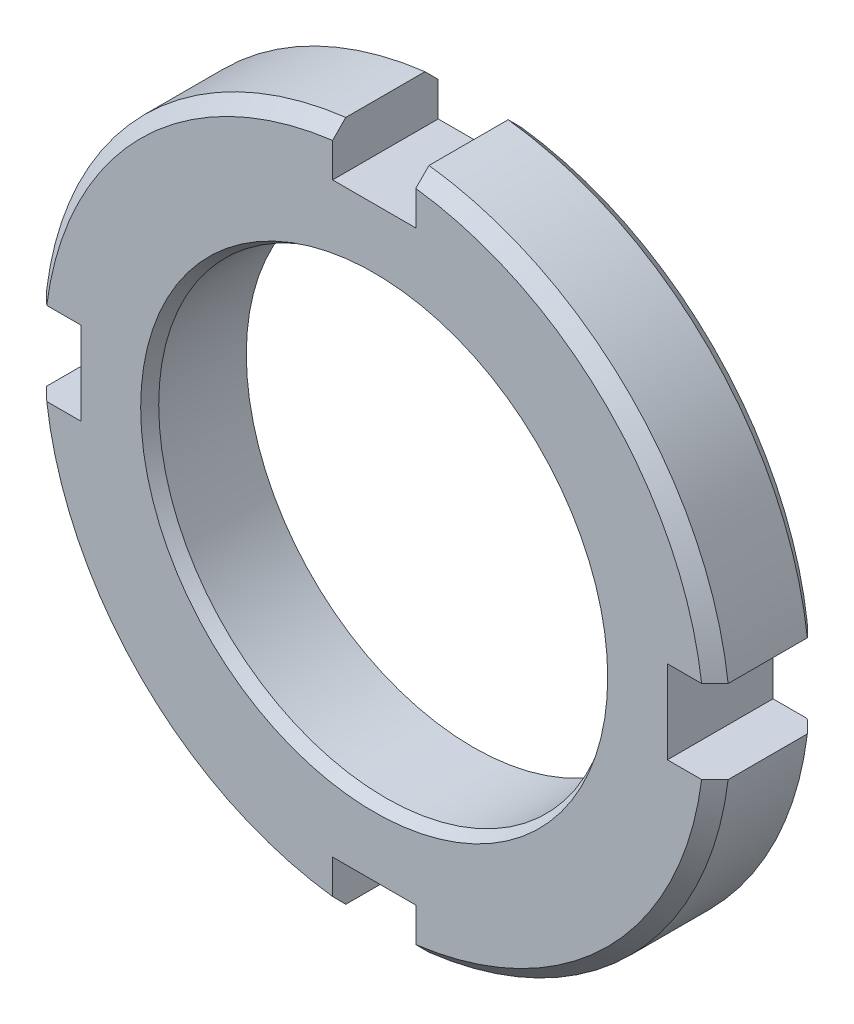
ISO-10303-21;
HEADER;
FILE_DESCRIPTION(('STEP AP214'),'2;1');
FILE_NAME('part.step','',(''),(''),'','','');
FILE_SCHEMA(('AUTOMOTIVE_DESIGN { 1 0 10303 214 1 1 1 1 }'));
ENDSEC;
DATA;
#1=APPLICATION_CONTEXT('core data for automotive mechanical design processes');
#2=APPLICATION_PROTOCOL_DEFINITION('international standard','automotive_design',2000,#1);
#3=PRODUCT_CONTEXT('',#1,'mechanical');
#4=PRODUCT('Part','Part','',(#3));
#5=PRODUCT_RELATED_PRODUCT_CATEGORY('part','',(#4));
#6=PRODUCT_DEFINITION_FORMATION('','',#4);
#7=PRODUCT_DEFINITION_CONTEXT('part definition',#1,'design');
#8=PRODUCT_DEFINITION('design','',#6,#7);
#9=PRODUCT_DEFINITION_SHAPE('','',#8);
#10=(LENGTH_UNIT() NAMED_UNIT(*) SI_UNIT(.MILLI.,.METRE.));
#11=(NAMED_UNIT(*) PLANE_ANGLE_UNIT() SI_UNIT($,.RADIAN.));
#12=(NAMED_UNIT(*) SI_UNIT($,.STERADIAN.) SOLID_ANGLE_UNIT());
#13=UNCERTAINTY_MEASURE_WITH_UNIT(LENGTH_MEASURE(1.E-05),#10,'distance_accuracy_value','');
#14=(GEOMETRIC_REPRESENTATION_CONTEXT(3) GLOBAL_UNCERTAINTY_ASSIGNED_CONTEXT((#13)) GLOBAL_UNIT_ASSIGNED_CONTEXT((#10,
#11,#12)) REPRESENTATION_CONTEXT('',''));
#15=CARTESIAN_POINT('',(0.,0.,0.));
#16=DIRECTION('',(0.,0.,1.));
#17=DIRECTION('',(1.,0.,0.));
#18=AXIS2_PLACEMENT_3D('',#15,#16,#17);
#19=CARTESIAN_POINT('',(-39.8927440078154,34.8636782085237,-2.53058728906308));
#20=DIRECTION('',(0.,0.,1.));
#21=DIRECTION('',(1.,0.,0.));
#22=AXIS2_PLACEMENT_3D('',#19,#20,#21);
#23=CYLINDRICAL_SURFACE('',#22,26.);
#24=DIRECTION('',(0.,0.,1.));
#25=VECTOR('',#24,1.);
#26=CARTESIAN_POINT('',(-14.0842667183665,31.7136782085239,-2.53058728906308));
#27=LINE('',#26,#25);
#28=CARTESIAN_POINT('',(-14.0842667183665,31.7136782085239,-1.53058728906307));
#29=VERTEX_POINT('',#28);
#30=CARTESIAN_POINT('',(-14.0842667183665,31.7136782085239,4.46941271093694));
#31=VERTEX_POINT('',#30);
#32=EDGE_CURVE('E216',#29,#31,#27,.T.);
#33=ORIENTED_EDGE('',*,*,#32,.T.);
#34=CARTESIAN_POINT('',(-39.8927440078154,34.8636782085237,4.46941271093694));
#35=DIRECTION('',(0.,0.,1.));
#36=DIRECTION('',(1.,0.,0.));
#37=AXIS2_PLACEMENT_3D('',#34,#35,#36);
#38=CIRCLE('',#37,26.);
#39=CARTESIAN_POINT('',(-36.7427440078152,9.05520091907478,4.46941271093694));
#40=VERTEX_POINT('',#39);
#41=EDGE_CURVE('E44',#31,#40,#38,.F.);
#42=ORIENTED_EDGE('',*,*,#41,.T.);
#43=DIRECTION('',(0.,0.,1.));
#44=VECTOR('',#43,1.);
#45=CARTESIAN_POINT('',(-36.7427440078152,9.05520091907478,-2.53058728906308));
#46=LINE('',#45,#44);
#47=CARTESIAN_POINT('',(-36.7427440078152,9.05520091907478,-1.53058728906307));
#48=VERTEX_POINT('',#47);
#49=EDGE_CURVE('E326',#48,#40,#46,.T.);
#50=ORIENTED_EDGE('',*,*,#49,.F.);
#51=CARTESIAN_POINT('',(-39.8927440078154,34.8636782085237,-1.53058728906307));
#52=DIRECTION('',(0.,0.,1.));
#53=DIRECTION('',(1.,0.,0.));
#54=AXIS2_PLACEMENT_3D('',#51,#52,#53);
#55=CIRCLE('',#54,26.);
#56=EDGE_CURVE('E533',#48,#29,#55,.T.);
#57=ORIENTED_EDGE('',*,*,#56,.T.);
#58=EDGE_LOOP('',(#33,#42,#50,#57));
#59=FACE_BOUND('',#58,.T.);
#60=ADVANCED_FACE('F16',(#59),#23,.T.);
#61=CARTESIAN_POINT('',(-39.8927440078154,34.8636782085237,-1.53058728906307));
#62=DIRECTION('',(0.,0.,1.));
#63=DIRECTION('',(1.,0.,0.));
#64=AXIS2_PLACEMENT_3D('',#61,#62,#63);
#65=CONICAL_SURFACE('',#64,26.,0.785398163397448);
#66=CARTESIAN_POINT('',(-9.9485887545726,31.713678208524,2.57879553141844));
#67=CARTESIAN_POINT('',(-10.7924569764367,31.713678208524,1.73957249010261));
#68=CARTESIAN_POINT('',(-11.6365050095065,31.713678208524,0.900530120004622));
#69=CARTESIAN_POINT('',(-13.3251098065626,31.713678208524,-0.777041316014575));
#70=CARTESIAN_POINT('',(-14.1696665701881,31.7136782085239,-1.61557038229916));
#71=CARTESIAN_POINT('',(-15.8594394613672,31.7136782085239,-3.29196476512256));
#72=CARTESIAN_POINT('',(-16.7046555891774,31.7136782085239,-4.12983008140295));
#73=CARTESIAN_POINT('',(-18.3960268544739,31.7136782085239,-5.80461351611076));
#74=CARTESIAN_POINT('',(-19.242181992636,31.7136782085239,-6.64153163385572));
#75=CARTESIAN_POINT('',(-20.0889460147055,31.7136782085239,-7.47783398803469));
#76=B_SPLINE_CURVE_WITH_KNOTS('',3,(#66,#67,#68,#69,#70,#71,#72,#73,#74,#75),.UNSPECIFIED.,.F.,
.F.,(4,2,2,2,4),(0.,3.57038943374278,7.14077633708091,10.7111646298825,14.2815554934974),.UNSPECIFIED.);
#77=CARTESIAN_POINT('',(-15.0919879709523,31.7136782085239,-2.53058728906308));
#78=VERTEX_POINT('',#77);
#79=EDGE_CURVE('E229',#29,#78,#76,.T.);
#80=ORIENTED_EDGE('',*,*,#79,.F.);
#81=ORIENTED_EDGE('',*,*,#56,.F.);
#82=CARTESIAN_POINT('',(-36.7427440078153,14.6052894238009,-7.02876258605232));
#83=CARTESIAN_POINT('',(-36.7427440078153,13.7587521590902,-6.19223095253893));
#84=CARTESIAN_POINT('',(-36.7427440078153,12.912786018082,-5.35512200537753));
#85=CARTESIAN_POINT('',(-36.7427440078152,11.2217379726777,-3.68001245800412));
#86=CARTESIAN_POINT('',(-36.7427440078152,10.3766560677128,-2.84201185836665));
#87=CARTESIAN_POINT('',(-36.7427440078152,8.68711768311953,-1.16538118913907));
#88=CARTESIAN_POINT('',(-36.7427440078152,7.84266120327733,-0.326751119764507));
#89=CARTESIAN_POINT('',(-36.7427440078152,6.15423265649125,1.35099761382771));
#90=CARTESIAN_POINT('',(-36.7427440078152,5.31026058985502,2.19011627835498));
#91=CARTESIAN_POINT('',(-36.7427440078152,4.46646090396963,3.02940812749877));
#92=B_SPLINE_CURVE_WITH_KNOTS('',3,(#82,#83,#84,#85,#86,#87,#88,#89,#90,#91),.UNSPECIFIED.,.F.,
.F.,(4,2,2,2,4),(0.,3.57039046486273,7.140778630482,10.7111655740227,14.2815547825693),.UNSPECIFIED.);
#93=CARTESIAN_POINT('',(-36.7427440078152,10.0629221716606,-2.53058728906308));
#94=VERTEX_POINT('',#93);
#95=EDGE_CURVE('E320',#94,#48,#92,.T.);
#96=ORIENTED_EDGE('',*,*,#95,.F.);
#97=CARTESIAN_POINT('',(-39.8927440078154,34.8636782085237,-2.53058728906308));
#98=DIRECTION('',(0.,0.,1.));
#99=DIRECTION('',(1.,0.,0.));
#100=AXIS2_PLACEMENT_3D('',#97,#98,#99);
#101=CIRCLE('',#100,25.);
#102=EDGE_CURVE('E413',#78,#94,#101,.F.);
#103=ORIENTED_EDGE('',*,*,#102,.F.);
#104=EDGE_LOOP('',(#80,#81,#96,#103));
#105=FACE_BOUND('',#104,.T.);
#106=ADVANCED_FACE('F530',(#105),#65,.T.);
#107=CARTESIAN_POINT('',(-39.8927440078154,34.8636782085237,5.46941271093692));
#108=DIRECTION('',(0.,0.,-1.));
#109=DIRECTION('',(-1.,0.,0.));
#110=AXIS2_PLACEMENT_3D('',#107,#108,#109);
#111=CONICAL_SURFACE('',#110,25.,0.785398163397452);
#112=CARTESIAN_POINT('',(-20.0889460147055,31.7136782085239,10.4166594099085));
#113=CARTESIAN_POINT('',(-19.242181992636,31.7136782085239,9.58035705572955));
#114=CARTESIAN_POINT('',(-18.3960268544739,31.7136782085239,8.74343893798459));
#115=CARTESIAN_POINT('',(-16.7046555891774,31.7136782085239,7.0686555032768));
#116=CARTESIAN_POINT('',(-15.8594394613672,31.7136782085239,6.23079018699641));
#117=CARTESIAN_POINT('',(-14.1696665701881,31.7136782085239,4.55439580417302));
#118=CARTESIAN_POINT('',(-13.3251098065626,31.713678208524,3.71586673788845));
#119=CARTESIAN_POINT('',(-11.6365050095065,31.713678208524,2.03829530186926));
#120=CARTESIAN_POINT('',(-10.7924569764367,31.713678208524,1.19925293177129));
#121=CARTESIAN_POINT('',(-9.9485887545726,31.713678208524,0.360029890455464));
#122=B_SPLINE_CURVE_WITH_KNOTS('',3,(#112,#113,#114,#115,#116,#117,#118,#119,#120,#121),
.UNSPECIFIED.,.F.,.F.,(4,2,2,2,4),(0.,3.5703908636149,7.14077915641647,10.7111660597546,
14.2815554934973),.UNSPECIFIED.);
#123=CARTESIAN_POINT('',(-15.0919879709523,31.7136782085239,5.46941271093692));
#124=VERTEX_POINT('',#123);
#125=EDGE_CURVE('E10',#124,#31,#122,.T.);
#126=ORIENTED_EDGE('',*,*,#125,.F.);
#127=CARTESIAN_POINT('',(-39.8927440078154,34.8636782085237,5.46941271093692));
#128=DIRECTION('',(0.,0.,1.));
#129=DIRECTION('',(1.,0.,0.));
#130=AXIS2_PLACEMENT_3D('',#127,#128,#129);
#131=CIRCLE('',#130,25.);
#132=CARTESIAN_POINT('',(-36.7427440078152,10.0629221716606,5.46941271093692));
#133=VERTEX_POINT('',#132);
#134=EDGE_CURVE('E468',#133,#124,#131,.T.);
#135=ORIENTED_EDGE('',*,*,#134,.F.);
#136=CARTESIAN_POINT('',(-36.7427440078152,4.46646090396963,-0.0905827056248698));
#137=CARTESIAN_POINT('',(-36.7427440078152,5.31026058985502,0.748709143518904));
#138=CARTESIAN_POINT('',(-36.7427440078152,6.15423265649125,1.58782780804617));
#139=CARTESIAN_POINT('',(-36.7427440078152,7.84266120327733,3.26557654163838));
#140=CARTESIAN_POINT('',(-36.7427440078152,8.68711768311953,4.10420661101294));
#141=CARTESIAN_POINT('',(-36.7427440078152,10.3766560677127,5.78083728024051));
#142=CARTESIAN_POINT('',(-36.7427440078152,11.2217379726777,6.61883787987797));
#143=CARTESIAN_POINT('',(-36.7427440078153,12.9127860180819,8.29394742725137));
#144=CARTESIAN_POINT('',(-36.7427440078153,13.7587521590902,9.13105637441276));
#145=CARTESIAN_POINT('',(-36.7427440078153,14.6052894238009,9.96758800792614));
#146=B_SPLINE_CURVE_WITH_KNOTS('',3,(#136,#137,#138,#139,#140,#141,#142,#143,#144,#145),
.UNSPECIFIED.,.F.,.F.,(4,2,2,2,4),(0.,3.57038920854665,7.14077615208733,10.7111643177066,
14.2815547825693),.UNSPECIFIED.);
#147=EDGE_CURVE('E299',#40,#133,#146,.T.);
#148=ORIENTED_EDGE('',*,*,#147,.F.);
#149=ORIENTED_EDGE('',*,*,#41,.F.);
#150=EDGE_LOOP('',(#126,#135,#148,#149));
#151=FACE_BOUND('',#150,.T.);
#152=ADVANCED_FACE('F261',(#151),#111,.T.);
#153=DIRECTION('',(0.,0.,1.));
#154=VECTOR('',#153,1.);
#155=CARTESIAN_POINT('',(-43.0427440078152,9.05520091907474,-2.53058728906308));
#156=LINE('',#155,#154);
#157=CARTESIAN_POINT('',(-43.0427440078152,9.05520091907474,-1.53058728906308));
#158=VERTEX_POINT('',#157);
#159=CARTESIAN_POINT('',(-43.0427440078152,9.05520091907474,4.46941271093694));
#160=VERTEX_POINT('',#159);
#161=EDGE_CURVE('E324',#158,#160,#156,.T.);
#162=ORIENTED_EDGE('',*,*,#161,.T.);
#163=CARTESIAN_POINT('',(-65.7012212972643,31.7136782085236,4.46941271093694));
#164=VERTEX_POINT('',#163);
#165=EDGE_CURVE('E448',#160,#164,#38,.F.);
#166=ORIENTED_EDGE('',*,*,#165,.T.);
#167=DIRECTION('',(0.,0.,1.));
#168=VECTOR('',#167,1.);
#169=CARTESIAN_POINT('',(-65.7012212972643,31.7136782085236,-2.53058728906308));
#170=LINE('',#169,#168);
#171=CARTESIAN_POINT('',(-65.7012212972643,31.7136782085236,-1.53058728906307));
#172=VERTEX_POINT('',#171);
#173=EDGE_CURVE('E343',#172,#164,#170,.T.);
#174=ORIENTED_EDGE('',*,*,#173,.F.);
#175=EDGE_CURVE('E407',#172,#158,#55,.T.);
#176=ORIENTED_EDGE('',*,*,#175,.T.);
#177=EDGE_LOOP('',(#162,#166,#174,#176));
#178=FACE_BOUND('',#177,.T.);
#179=ADVANCED_FACE('F453',(#178),#23,.T.);
#180=CARTESIAN_POINT('',(-43.0427440078152,4.46646090396959,3.02940812749877));
#181=CARTESIAN_POINT('',(-43.0427440078152,5.31026058985498,2.19011627835499));
#182=CARTESIAN_POINT('',(-43.0427440078152,6.15423265649121,1.35099761382771));
#183=CARTESIAN_POINT('',(-43.0427440078152,7.84266120327729,-0.326751119764509));
#184=CARTESIAN_POINT('',(-43.0427440078152,8.68711768311949,-1.16538118913907));
#185=CARTESIAN_POINT('',(-43.0427440078153,10.3766560677127,-2.84201185836666));
#186=CARTESIAN_POINT('',(-43.0427440078153,11.2217379726777,-3.68001245800412));
#187=CARTESIAN_POINT('',(-43.0427440078153,12.9127860180819,-5.35512200537754));
#188=CARTESIAN_POINT('',(-43.0427440078153,13.7587521590902,-6.19223095253894));
#189=CARTESIAN_POINT('',(-43.0427440078153,14.6052894238009,-7.02876258605232));
#190=B_SPLINE_CURVE_WITH_KNOTS('',3,(#180,#181,#182,#183,#184,#185,#186,#187,#188,#189),
.UNSPECIFIED.,.F.,.F.,(4,2,2,2,4),(0.,3.57038920854667,7.14077615208735,10.7111643177066,
14.2815547825693),.UNSPECIFIED.);
#191=CARTESIAN_POINT('',(-43.0427440078152,10.0629221716606,-2.53058728906308));
#192=VERTEX_POINT('',#191);
#193=EDGE_CURVE('E322',#158,#192,#190,.T.);
#194=ORIENTED_EDGE('',*,*,#193,.F.);
#195=ORIENTED_EDGE('',*,*,#175,.F.);
#196=CARTESIAN_POINT('',(-60.1511327925382,31.7136782085236,-7.02876258605232));
#197=CARTESIAN_POINT('',(-60.9976700572489,31.7136782085236,-6.19223095253893));
#198=CARTESIAN_POINT('',(-61.8436361982572,31.7136782085236,-5.35512200537753));
#199=CARTESIAN_POINT('',(-63.5346842436613,31.7136782085236,-3.68001245800412));
#200=CARTESIAN_POINT('',(-64.3797661486264,31.7136782085236,-2.84201185836665));
#201=CARTESIAN_POINT('',(-66.0693045332196,31.7136782085236,-1.16538118913907));
#202=CARTESIAN_POINT('',(-66.9137610130618,31.7136782085236,-0.3267511197645));
#203=CARTESIAN_POINT('',(-68.6021895598478,31.7136782085236,1.35099761382772));
#204=CARTESIAN_POINT('',(-69.4461616264841,31.7136782085236,2.19011627835499));
#205=CARTESIAN_POINT('',(-70.2899613123695,31.7136782085236,3.02940812749877));
#206=B_SPLINE_CURVE_WITH_KNOTS('',3,(#196,#197,#198,#199,#200,#201,#202,#203,#204,#205),
.UNSPECIFIED.,.F.,.F.,(4,2,2,2,4),(0.,3.57039046486273,7.140778630482,10.7111655740227,
14.2815547825694),.UNSPECIFIED.);
#207=CARTESIAN_POINT('',(-64.6935000446785,31.7136782085236,-2.53058728906308));
#208=VERTEX_POINT('',#207);
#209=EDGE_CURVE('E352',#208,#172,#206,.T.);
#210=ORIENTED_EDGE('',*,*,#209,.F.);
#211=EDGE_CURVE('E511',#192,#208,#101,.F.);
#212=ORIENTED_EDGE('',*,*,#211,.F.);
#213=EDGE_LOOP('',(#194,#195,#210,#212));
#214=FACE_BOUND('',#213,.T.);
#215=ADVANCED_FACE('F534',(#214),#65,.T.);
#216=CARTESIAN_POINT('',(-43.0427440078153,14.6052894238009,9.96758800792614));
#217=CARTESIAN_POINT('',(-43.0427440078153,13.7587521590902,9.13105637441276));
#218=CARTESIAN_POINT('',(-43.0427440078153,12.9127860180819,8.29394742725137));
#219=CARTESIAN_POINT('',(-43.0427440078153,11.2217379726777,6.61883787987797));
#220=CARTESIAN_POINT('',(-43.0427440078153,10.3766560677127,5.78083728024051));
#221=CARTESIAN_POINT('',(-43.0427440078152,8.68711768311949,4.10420661101294));
#222=CARTESIAN_POINT('',(-43.0427440078152,7.84266120327729,3.26557654163838));
#223=CARTESIAN_POINT('',(-43.0427440078152,6.15423265649121,1.58782780804618));
#224=CARTESIAN_POINT('',(-43.0427440078152,5.31026058985498,0.748709143518909));
#225=CARTESIAN_POINT('',(-43.0427440078152,4.46646090396959,-0.0905827056248672));
#226=B_SPLINE_CURVE_WITH_KNOTS('',3,(#216,#217,#218,#219,#220,#221,#222,#223,#224,#225),
.UNSPECIFIED.,.F.,.F.,(4,2,2,2,4),(0.,3.57039046486271,7.14077863048197,10.7111655740226,
14.2815547825693),.UNSPECIFIED.);
#227=CARTESIAN_POINT('',(-43.0427440078152,10.0629221716606,5.46941271093692));
#228=VERTEX_POINT('',#227);
#229=EDGE_CURVE('E249',#228,#160,#226,.T.);
#230=ORIENTED_EDGE('',*,*,#229,.F.);
#231=CARTESIAN_POINT('',(-64.6935000446785,31.7136782085236,5.46941271093692));
#232=VERTEX_POINT('',#231);
#233=EDGE_CURVE('E418',#232,#228,#131,.T.);
#234=ORIENTED_EDGE('',*,*,#233,.F.);
#235=CARTESIAN_POINT('',(-70.2899613123695,31.7136782085236,-0.0905827056248698));
#236=CARTESIAN_POINT('',(-69.4461616264841,31.7136782085236,0.748709143518905));
#237=CARTESIAN_POINT('',(-68.6021895598478,31.7136782085236,1.58782780804617));
#238=CARTESIAN_POINT('',(-66.9137610130618,31.7136782085236,3.26557654163837));
#239=CARTESIAN_POINT('',(-66.0693045332196,31.7136782085236,4.10420661101293));
#240=CARTESIAN_POINT('',(-64.3797661486264,31.7136782085236,5.78083728024051));
#241=CARTESIAN_POINT('',(-63.5346842436613,31.7136782085236,6.61883787987797));
#242=CARTESIAN_POINT('',(-61.8436361982572,31.7136782085236,8.29394742725137));
#243=CARTESIAN_POINT('',(-60.9976700572489,31.7136782085236,9.13105637441276));
#244=CARTESIAN_POINT('',(-60.1511327925382,31.7136782085236,9.96758800792614));
#245=B_SPLINE_CURVE_WITH_KNOTS('',3,(#235,#236,#237,#238,#239,#240,#241,#242,#243,#244),
.UNSPECIFIED.,.F.,.F.,(4,2,2,2,4),(0.,3.57038920854666,7.14077615208733,10.7111643177066,
14.2815547825693),.UNSPECIFIED.);
#246=EDGE_CURVE('E285',#164,#232,#245,.T.);
#247=ORIENTED_EDGE('',*,*,#246,.F.);
#248=ORIENTED_EDGE('',*,*,#165,.F.);
#249=EDGE_LOOP('',(#230,#234,#247,#248));
#250=FACE_BOUND('',#249,.T.);
#251=ADVANCED_FACE('F465',(#250),#111,.T.);
#252=DIRECTION('',(0.,0.,1.));
#253=VECTOR('',#252,1.);
#254=CARTESIAN_POINT('',(-65.7012212972643,38.0136782085236,-2.53058728906308));
#255=LINE('',#254,#253);
#256=CARTESIAN_POINT('',(-65.7012212972643,38.0136782085236,-1.53058728906308));
#257=VERTEX_POINT('',#256);
#258=CARTESIAN_POINT('',(-65.7012212972643,38.0136782085236,4.46941271093694));
#259=VERTEX_POINT('',#258);
#260=EDGE_CURVE('E349',#257,#259,#255,.T.);
#261=ORIENTED_EDGE('',*,*,#260,.T.);
#262=CARTESIAN_POINT('',(-43.0427440078154,60.6721554979726,4.46941271093694));
#263=VERTEX_POINT('',#262);
#264=EDGE_CURVE('E394',#259,#263,#38,.F.);
#265=ORIENTED_EDGE('',*,*,#264,.T.);
#266=DIRECTION('',(0.,0.,1.));
#267=VECTOR('',#266,1.);
#268=CARTESIAN_POINT('',(-43.0427440078154,60.6721554979726,-2.53058728906308));
#269=LINE('',#268,#267);
#270=CARTESIAN_POINT('',(-43.0427440078154,60.6721554979726,-1.53058728906307));
#271=VERTEX_POINT('',#270);
#272=EDGE_CURVE('E494',#271,#263,#269,.T.);
#273=ORIENTED_EDGE('',*,*,#272,.F.);
#274=EDGE_CURVE('E402',#271,#257,#55,.T.);
#275=ORIENTED_EDGE('',*,*,#274,.T.);
#276=EDGE_LOOP('',(#261,#265,#273,#275));
#277=FACE_BOUND('',#276,.T.);
#278=ADVANCED_FACE('F446',(#277),#23,.T.);
#279=CARTESIAN_POINT('',(-70.2899613123695,38.0136782085236,3.02940812749877));
#280=CARTESIAN_POINT('',(-69.4461616264841,38.0136782085236,2.19011627835499));
#281=CARTESIAN_POINT('',(-68.6021895598479,38.0136782085236,1.35099761382772));
#282=CARTESIAN_POINT('',(-66.9137610130618,38.0136782085236,-0.326751119764507));
#283=CARTESIAN_POINT('',(-66.0693045332196,38.0136782085236,-1.16538118913907));
#284=CARTESIAN_POINT('',(-64.3797661486264,38.0136782085236,-2.84201185836666));
#285=CARTESIAN_POINT('',(-63.5346842436614,38.0136782085236,-3.68001245800412));
#286=CARTESIAN_POINT('',(-61.8436361982572,38.0136782085236,-5.35512200537753));
#287=CARTESIAN_POINT('',(-60.9976700572489,38.0136782085236,-6.19223095253893));
#288=CARTESIAN_POINT('',(-60.1511327925382,38.0136782085236,-7.02876258605232));
#289=B_SPLINE_CURVE_WITH_KNOTS('',3,(#279,#280,#281,#282,#283,#284,#285,#286,#287,#288),
.UNSPECIFIED.,.F.,.F.,(4,2,2,2,4),(0.,3.57038920854667,7.14077615208735,10.7111643177066,
14.2815547825694),.UNSPECIFIED.);
#290=CARTESIAN_POINT('',(-64.6935000446785,38.0136782085236,-2.53058728906308));
#291=VERTEX_POINT('',#290);
#292=EDGE_CURVE('E368',#257,#291,#289,.T.);
#293=ORIENTED_EDGE('',*,*,#292,.F.);
#294=ORIENTED_EDGE('',*,*,#274,.F.);
#295=CARTESIAN_POINT('',(-43.0427440078154,54.6674762016336,-7.47783398803469));
#296=CARTESIAN_POINT('',(-43.0427440078154,55.514240223703,-6.64153163385573));
#297=CARTESIAN_POINT('',(-43.0427440078154,56.3603953618651,-5.80461351611076));
#298=CARTESIAN_POINT('',(-43.0427440078154,58.0517666271617,-4.12983008140295));
#299=CARTESIAN_POINT('',(-43.0427440078154,58.8969827549718,-3.29196476512256));
#300=CARTESIAN_POINT('',(-43.0427440078154,60.5867556461509,-1.61557038229915));
#301=CARTESIAN_POINT('',(-43.0427440078154,61.4313124097764,-0.777041316014574));
#302=CARTESIAN_POINT('',(-43.0427440078154,63.1199172068326,0.900530120004623));
#303=CARTESIAN_POINT('',(-43.0427440078154,63.9639652399023,1.73957249010261));
#304=CARTESIAN_POINT('',(-43.0427440078154,64.8078334617664,2.57879553141844));
#305=B_SPLINE_CURVE_WITH_KNOTS('',3,(#295,#296,#297,#298,#299,#300,#301,#302,#303,#304),
.UNSPECIFIED.,.F.,.F.,(4,2,2,2,4),(0.,3.57039086361492,7.1407791564165,10.7111660597546,
14.2815554934974),.UNSPECIFIED.);
#306=CARTESIAN_POINT('',(-43.0427440078154,59.6644342453867,-2.53058728906308));
#307=VERTEX_POINT('',#306);
#308=EDGE_CURVE('E393',#307,#271,#305,.T.);
#309=ORIENTED_EDGE('',*,*,#308,.F.);
#310=EDGE_CURVE('E410',#291,#307,#101,.F.);
#311=ORIENTED_EDGE('',*,*,#310,.F.);
#312=EDGE_LOOP('',(#293,#294,#309,#311));
#313=FACE_BOUND('',#312,.T.);
#314=ADVANCED_FACE('F568',(#313),#65,.T.);
#315=CARTESIAN_POINT('',(-60.1511327925382,38.0136782085236,9.96758800792614));
#316=CARTESIAN_POINT('',(-60.9976700572489,38.0136782085236,9.13105637441276));
#317=CARTESIAN_POINT('',(-61.8436361982572,38.0136782085236,8.29394742725137));
#318=CARTESIAN_POINT('',(-63.5346842436614,38.0136782085236,6.61883787987797));
#319=CARTESIAN_POINT('',(-64.3797661486264,38.0136782085236,5.78083728024051));
#320=CARTESIAN_POINT('',(-66.0693045332196,38.0136782085236,4.10420661101293));
#321=CARTESIAN_POINT('',(-66.9137610130618,38.0136782085236,3.26557654163838));
#322=CARTESIAN_POINT('',(-68.6021895598479,38.0136782085236,1.58782780804617));
#323=CARTESIAN_POINT('',(-69.4461616264841,38.0136782085236,0.748709143518906));
#324=CARTESIAN_POINT('',(-70.2899613123695,38.0136782085236,-0.0905827056248707));
#325=B_SPLINE_CURVE_WITH_KNOTS('',3,(#315,#316,#317,#318,#319,#320,#321,#322,#323,#324),
.UNSPECIFIED.,.F.,.F.,(4,2,2,2,4),(0.,3.57039046486272,7.14077863048197,10.7111655740226,
14.2815547825693),.UNSPECIFIED.);
#326=CARTESIAN_POINT('',(-64.6935000446785,38.0136782085236,5.46941271093692));
#327=VERTEX_POINT('',#326);
#328=EDGE_CURVE('E293',#327,#259,#325,.T.);
#329=ORIENTED_EDGE('',*,*,#328,.F.);
#330=CARTESIAN_POINT('',(-43.0427440078154,59.6644342453868,5.46941271093692));
#331=VERTEX_POINT('',#330);
#332=EDGE_CURVE('E415',#331,#327,#131,.T.);
#333=ORIENTED_EDGE('',*,*,#332,.F.);
#334=CARTESIAN_POINT('',(-43.0427440078154,64.8078334617664,0.360029890455465));
#335=CARTESIAN_POINT('',(-43.0427440078154,63.9639652399023,1.19925293177129));
#336=CARTESIAN_POINT('',(-43.0427440078154,63.1199172068326,2.03829530186927));
#337=CARTESIAN_POINT('',(-43.0427440078154,61.4313124097764,3.71586673788845));
#338=CARTESIAN_POINT('',(-43.0427440078154,60.5867556461509,4.55439580417302));
#339=CARTESIAN_POINT('',(-43.0427440078154,58.8969827549718,6.23079018699641));
#340=CARTESIAN_POINT('',(-43.0427440078154,58.0517666271617,7.0686555032768));
#341=CARTESIAN_POINT('',(-43.0427440078154,56.3603953618651,8.74343893798459));
#342=CARTESIAN_POINT('',(-43.0427440078154,55.514240223703,9.58035705572955));
#343=CARTESIAN_POINT('',(-43.0427440078154,54.6674762016336,10.4166594099085));
#344=B_SPLINE_CURVE_WITH_KNOTS('',3,(#334,#335,#336,#337,#338,#339,#340,#341,#342,#343),
.UNSPECIFIED.,.F.,.F.,(4,2,2,2,4),(0.,3.57038943374276,7.14077633708086,10.7111646298824,
14.2815554934973),.UNSPECIFIED.);
#345=EDGE_CURVE('E270',#263,#331,#344,.T.);
#346=ORIENTED_EDGE('',*,*,#345,.F.);
#347=ORIENTED_EDGE('',*,*,#264,.F.);
#348=EDGE_LOOP('',(#329,#333,#346,#347));
#349=FACE_BOUND('',#348,.T.);
#350=ADVANCED_FACE('F265',(#349),#111,.T.);
#351=DIRECTION('',(0.,0.,1.));
#352=VECTOR('',#351,1.);
#353=CARTESIAN_POINT('',(-14.0842667183665,38.0136782085239,-2.53058728906308));
#354=LINE('',#353,#352);
#355=CARTESIAN_POINT('',(-14.0842667183665,38.0136782085239,-1.53058728906308));
#356=VERTEX_POINT('',#355);
#357=CARTESIAN_POINT('',(-14.0842667183665,38.0136782085239,4.46941271093694));
#358=VERTEX_POINT('',#357);
#359=EDGE_CURVE('E40',#356,#358,#354,.T.);
#360=ORIENTED_EDGE('',*,*,#359,.F.);
#361=CARTESIAN_POINT('',(-36.7427440078154,60.6721554979726,-1.53058728906307));
#362=VERTEX_POINT('',#361);
#363=EDGE_CURVE('E403',#356,#362,#55,.T.);
#364=ORIENTED_EDGE('',*,*,#363,.T.);
#365=DIRECTION('',(0.,0.,1.));
#366=VECTOR('',#365,1.);
#367=CARTESIAN_POINT('',(-36.7427440078154,60.6721554979726,-2.53058728906308));
#368=LINE('',#367,#366);
#369=CARTESIAN_POINT('',(-36.7427440078154,60.6721554979726,4.46941271093694));
#370=VERTEX_POINT('',#369);
#371=EDGE_CURVE('E490',#362,#370,#368,.T.);
#372=ORIENTED_EDGE('',*,*,#371,.T.);
#373=EDGE_CURVE('E397',#370,#358,#38,.F.);
#374=ORIENTED_EDGE('',*,*,#373,.T.);
#375=EDGE_LOOP('',(#360,#364,#372,#374));
#376=FACE_BOUND('',#375,.T.);
#377=ADVANCED_FACE('F484',(#376),#23,.T.);
#378=CARTESIAN_POINT('',(-39.8927440078154,34.8636782085237,-2.53058728906308));
#379=DIRECTION('',(0.,0.,1.));
#380=DIRECTION('',(1.,0.,0.));
#381=AXIS2_PLACEMENT_3D('',#378,#379,#380);
#382=PLANE('',#381);
#383=CARTESIAN_POINT('',(-39.8927440078154,34.8636782085237,-2.53058728906308));
#384=DIRECTION('',(0.,0.,1.));
#385=DIRECTION('',(1.,0.,0.));
#386=AXIS2_PLACEMENT_3D('',#383,#384,#385);
#387=CIRCLE('',#386,18.0540254037844);
#388=CARTESIAN_POINT('',(-21.838718604031,34.8636782085237,-2.53058728906308));
#389=VERTEX_POINT('',#388);
#390=EDGE_CURVE('E424',#389,#389,#387,.T.);
#391=ORIENTED_EDGE('',*,*,#390,.T.);
#392=EDGE_LOOP('',(#391));
#393=FACE_BOUND('',#392,.T.);
#394=DIRECTION('',(0.,-1.,0.));
#395=VECTOR('',#394,1.);
#396=CARTESIAN_POINT('',(-17.6842667183665,38.0136782085239,-2.53058728906308));
#397=LINE('',#396,#395);
#398=CARTESIAN_POINT('',(-17.6842667183665,38.0136782085239,-2.53058728906308));
#399=VERTEX_POINT('',#398);
#400=CARTESIAN_POINT('',(-17.6842667183665,31.7136782085239,-2.53058728906308));
#401=VERTEX_POINT('',#400);
#402=EDGE_CURVE('E198',#399,#401,#397,.T.);
#403=ORIENTED_EDGE('',*,*,#402,.T.);
#404=DIRECTION('',(1.,0.,0.));
#405=VECTOR('',#404,1.);
#406=CARTESIAN_POINT('',(-14.0842667183665,31.7136782085239,-2.53058728906308));
#407=LINE('',#406,#405);
#408=EDGE_CURVE('E203',#401,#78,#407,.T.);
#409=ORIENTED_EDGE('',*,*,#408,.T.);
#410=ORIENTED_EDGE('',*,*,#102,.T.);
#411=DIRECTION('',(0.,1.,0.));
#412=VECTOR('',#411,1.);
#413=CARTESIAN_POINT('',(-36.7427440078152,9.05520091907478,-2.53058728906308));
#414=LINE('',#413,#412);
#415=CARTESIAN_POINT('',(-36.7427440078153,12.6552009190748,-2.53058728906308));
#416=VERTEX_POINT('',#415);
#417=EDGE_CURVE('E518',#94,#416,#414,.T.);
#418=ORIENTED_EDGE('',*,*,#417,.T.);
#419=DIRECTION('',(-1.,0.,0.));
#420=VECTOR('',#419,1.);
#421=CARTESIAN_POINT('',(-36.7427440078153,12.6552009190748,-2.53058728906308));
#422=LINE('',#421,#420);
#423=CARTESIAN_POINT('',(-43.0427440078153,12.6552009190747,-2.53058728906308));
#424=VERTEX_POINT('',#423);
#425=EDGE_CURVE('E528',#416,#424,#422,.T.);
#426=ORIENTED_EDGE('',*,*,#425,.T.);
#427=DIRECTION('',(0.,-1.,0.));
#428=VECTOR('',#427,1.);
#429=CARTESIAN_POINT('',(-43.0427440078152,9.05520091907474,-2.53058728906308));
#430=LINE('',#429,#428);
#431=EDGE_CURVE('E540',#424,#192,#430,.T.);
#432=ORIENTED_EDGE('',*,*,#431,.T.);
#433=ORIENTED_EDGE('',*,*,#211,.T.);
#434=DIRECTION('',(1.,0.,0.));
#435=VECTOR('',#434,1.);
#436=CARTESIAN_POINT('',(-65.7012212972643,31.7136782085236,-2.53058728906308));
#437=LINE('',#436,#435);
#438=CARTESIAN_POINT('',(-62.1012212972643,31.7136782085236,-2.53058728906308));
#439=VERTEX_POINT('',#438);
#440=EDGE_CURVE('E331',#208,#439,#437,.T.);
#441=ORIENTED_EDGE('',*,*,#440,.T.);
#442=DIRECTION('',(0.,1.,0.));
#443=VECTOR('',#442,1.);
#444=CARTESIAN_POINT('',(-62.1012212972643,31.7136782085236,-2.53058728906308));
#445=LINE('',#444,#443);
#446=CARTESIAN_POINT('',(-62.1012212972643,38.0136782085236,-2.53058728906308));
#447=VERTEX_POINT('',#446);
#448=EDGE_CURVE('E337',#439,#447,#445,.T.);
#449=ORIENTED_EDGE('',*,*,#448,.T.);
#450=DIRECTION('',(-1.,0.,0.));
#451=VECTOR('',#450,1.);
#452=CARTESIAN_POINT('',(-65.7012212972643,38.0136782085236,-2.53058728906308));
#453=LINE('',#452,#451);
#454=EDGE_CURVE('E344',#447,#291,#453,.T.);
#455=ORIENTED_EDGE('',*,*,#454,.T.);
#456=ORIENTED_EDGE('',*,*,#310,.T.);
#457=DIRECTION('',(0.,-1.,0.));
#458=VECTOR('',#457,1.);
#459=CARTESIAN_POINT('',(-43.0427440078154,60.6721554979726,-2.53058728906308));
#460=LINE('',#459,#458);
#461=CARTESIAN_POINT('',(-43.0427440078154,57.0721554979726,-2.53058728906308));
#462=VERTEX_POINT('',#461);
#463=EDGE_CURVE('E477',#307,#462,#460,.T.);
#464=ORIENTED_EDGE('',*,*,#463,.T.);
#465=DIRECTION('',(1.,0.,0.));
#466=VECTOR('',#465,1.);
#467=CARTESIAN_POINT('',(-43.0427440078154,57.0721554979726,-2.53058728906308));
#468=LINE('',#467,#466);
#469=CARTESIAN_POINT('',(-36.7427440078154,57.0721554979726,-2.53058728906308));
#470=VERTEX_POINT('',#469);
#471=EDGE_CURVE('E500',#462,#470,#468,.T.);
#472=ORIENTED_EDGE('',*,*,#471,.T.);
#473=DIRECTION('',(0.,1.,0.));
#474=VECTOR('',#473,1.);
#475=CARTESIAN_POINT('',(-36.7427440078154,60.6721554979726,-2.53058728906308));
#476=LINE('',#475,#474);
#477=CARTESIAN_POINT('',(-36.7427440078154,59.6644342453867,-2.53058728906308));
#478=VERTEX_POINT('',#477);
#479=EDGE_CURVE('E497',#470,#478,#476,.T.);
#480=ORIENTED_EDGE('',*,*,#479,.T.);
#481=CARTESIAN_POINT('',(-15.0919879709524,38.0136782085239,-2.53058728906308));
#482=VERTEX_POINT('',#481);
#483=EDGE_CURVE('E210',#478,#482,#101,.F.);
#484=ORIENTED_EDGE('',*,*,#483,.T.);
#485=DIRECTION('',(-1.,0.,0.));
#486=VECTOR('',#485,1.);
#487=CARTESIAN_POINT('',(-14.0842667183665,38.0136782085239,-2.53058728906308));
#488=LINE('',#487,#486);
#489=EDGE_CURVE('E186',#482,#399,#488,.T.);
#490=ORIENTED_EDGE('',*,*,#489,.T.);
#491=EDGE_LOOP('',(#403,#409,#410,#418,#426,#432,#433,#441,#449,#455,#456,#464,#472,#480,#484,#490));
#492=FACE_BOUND('',#491,.T.);
#493=ADVANCED_FACE('F204',(#393,#492),#382,.F.);
#494=CARTESIAN_POINT('',(-39.8927440078154,34.8636782085237,5.46941271093692));
#495=DIRECTION('',(0.,0.,1.));
#496=DIRECTION('',(1.,0.,0.));
#497=AXIS2_PLACEMENT_3D('',#494,#495,#496);
#498=PLANE('',#497);
#499=DIRECTION('',(1.,0.,0.));
#500=VECTOR('',#499,1.);
#501=CARTESIAN_POINT('',(-14.0842667183665,31.7136782085239,5.46941271093692));
#502=LINE('',#501,#500);
#503=CARTESIAN_POINT('',(-17.6842667183665,31.7136782085239,5.46941271093692));
#504=VERTEX_POINT('',#503);
#505=EDGE_CURVE('E208',#504,#124,#502,.T.);
#506=ORIENTED_EDGE('',*,*,#505,.F.);
#507=DIRECTION('',(0.,-1.,0.));
#508=VECTOR('',#507,1.);
#509=CARTESIAN_POINT('',(-17.6842667183665,38.0136782085239,5.46941271093692));
#510=LINE('',#509,#508);
#511=CARTESIAN_POINT('',(-17.6842667183665,38.0136782085239,5.46941271093692));
#512=VERTEX_POINT('',#511);
#513=EDGE_CURVE('E209',#512,#504,#510,.T.);
#514=ORIENTED_EDGE('',*,*,#513,.F.);
#515=DIRECTION('',(-1.,0.,0.));
#516=VECTOR('',#515,1.);
#517=CARTESIAN_POINT('',(-14.0842667183665,38.0136782085239,5.46941271093692));
#518=LINE('',#517,#516);
#519=CARTESIAN_POINT('',(-15.0919879709524,38.0136782085239,5.46941271093692));
#520=VERTEX_POINT('',#519);
#521=EDGE_CURVE('E188',#520,#512,#518,.T.);
#522=ORIENTED_EDGE('',*,*,#521,.F.);
#523=CARTESIAN_POINT('',(-36.7427440078154,59.6644342453868,5.46941271093692));
#524=VERTEX_POINT('',#523);
#525=EDGE_CURVE('E409',#520,#524,#131,.T.);
#526=ORIENTED_EDGE('',*,*,#525,.T.);
#527=DIRECTION('',(0.,1.,0.));
#528=VECTOR('',#527,1.);
#529=CARTESIAN_POINT('',(-36.7427440078154,60.6721554979726,5.46941271093692));
#530=LINE('',#529,#528);
#531=CARTESIAN_POINT('',(-36.7427440078154,57.0721554979726,5.46941271093692));
#532=VERTEX_POINT('',#531);
#533=EDGE_CURVE('E478',#532,#524,#530,.T.);
#534=ORIENTED_EDGE('',*,*,#533,.F.);
#535=DIRECTION('',(1.,0.,0.));
#536=VECTOR('',#535,1.);
#537=CARTESIAN_POINT('',(-43.0427440078154,57.0721554979726,5.46941271093692));
#538=LINE('',#537,#536);
#539=CARTESIAN_POINT('',(-43.0427440078154,57.0721554979726,5.46941271093692));
#540=VERTEX_POINT('',#539);
#541=EDGE_CURVE('E481',#540,#532,#538,.T.);
#542=ORIENTED_EDGE('',*,*,#541,.F.);
#543=DIRECTION('',(0.,-1.,0.));
#544=VECTOR('',#543,1.);
#545=CARTESIAN_POINT('',(-43.0427440078154,60.6721554979726,5.46941271093692));
#546=LINE('',#545,#544);
#547=EDGE_CURVE('E502',#331,#540,#546,.T.);
#548=ORIENTED_EDGE('',*,*,#547,.F.);
#549=ORIENTED_EDGE('',*,*,#332,.T.);
#550=DIRECTION('',(-1.,0.,0.));
#551=VECTOR('',#550,1.);
#552=CARTESIAN_POINT('',(-65.7012212972643,38.0136782085236,5.46941271093692));
#553=LINE('',#552,#551);
#554=CARTESIAN_POINT('',(-62.1012212972643,38.0136782085236,5.46941271093692));
#555=VERTEX_POINT('',#554);
#556=EDGE_CURVE('E339',#555,#327,#553,.T.);
#557=ORIENTED_EDGE('',*,*,#556,.F.);
#558=DIRECTION('',(0.,1.,0.));
#559=VECTOR('',#558,1.);
#560=CARTESIAN_POINT('',(-62.1012212972643,31.7136782085236,5.46941271093692));
#561=LINE('',#560,#559);
#562=CARTESIAN_POINT('',(-62.1012212972643,31.7136782085236,5.46941271093692));
#563=VERTEX_POINT('',#562);
#564=EDGE_CURVE('E350',#563,#555,#561,.T.);
#565=ORIENTED_EDGE('',*,*,#564,.F.);
#566=DIRECTION('',(1.,0.,0.));
#567=VECTOR('',#566,1.);
#568=CARTESIAN_POINT('',(-65.7012212972643,31.7136782085236,5.46941271093692));
#569=LINE('',#568,#567);
#570=EDGE_CURVE('E334',#232,#563,#569,.T.);
#571=ORIENTED_EDGE('',*,*,#570,.F.);
#572=ORIENTED_EDGE('',*,*,#233,.T.);
#573=DIRECTION('',(0.,-1.,0.));
#574=VECTOR('',#573,1.);
#575=CARTESIAN_POINT('',(-43.0427440078152,9.05520091907474,5.46941271093692));
#576=LINE('',#575,#574);
#577=CARTESIAN_POINT('',(-43.0427440078153,12.6552009190747,5.46941271093692));
#578=VERTEX_POINT('',#577);
#579=EDGE_CURVE('E527',#578,#228,#576,.T.);
#580=ORIENTED_EDGE('',*,*,#579,.F.);
#581=DIRECTION('',(-1.,0.,0.));
#582=VECTOR('',#581,1.);
#583=CARTESIAN_POINT('',(-36.7427440078153,12.6552009190748,5.46941271093692));
#584=LINE('',#583,#582);
#585=CARTESIAN_POINT('',(-36.7427440078153,12.6552009190748,5.46941271093692));
#586=VERTEX_POINT('',#585);
#587=EDGE_CURVE('E543',#586,#578,#584,.T.);
#588=ORIENTED_EDGE('',*,*,#587,.F.);
#589=DIRECTION('',(0.,1.,0.));
#590=VECTOR('',#589,1.);
#591=CARTESIAN_POINT('',(-36.7427440078152,9.05520091907478,5.46941271093692));
#592=LINE('',#591,#590);
#593=EDGE_CURVE('E541',#133,#586,#592,.T.);
#594=ORIENTED_EDGE('',*,*,#593,.F.);
#595=ORIENTED_EDGE('',*,*,#134,.T.);
#596=EDGE_LOOP('',(#506,#514,#522,#526,#534,#542,#548,#549,#557,#565,#571,#572,#580,#588,#594,#595));
#597=FACE_BOUND('',#596,.T.);
#598=CARTESIAN_POINT('',(-39.8927440078154,34.8636782085237,5.46941271093692));
#599=DIRECTION('',(0.,0.,1.));
#600=DIRECTION('',(1.,0.,0.));
#601=AXIS2_PLACEMENT_3D('',#598,#599,#600);
#602=CIRCLE('',#601,17.688);
#603=CARTESIAN_POINT('',(-22.2047440078154,34.8636782085237,5.46941271093692));
#604=VERTEX_POINT('',#603);
#605=EDGE_CURVE('E425',#604,#604,#602,.F.);
#606=ORIENTED_EDGE('',*,*,#605,.T.);
#607=EDGE_LOOP('',(#606));
#608=FACE_BOUND('',#607,.T.);
#609=ADVANCED_FACE('F471',(#597,#608),#498,.T.);
#610=CARTESIAN_POINT('',(-20.0889460147055,38.0136782085239,-7.4778339880347));
#611=CARTESIAN_POINT('',(-19.2421819926361,38.0136782085239,-6.64153163385573));
#612=CARTESIAN_POINT('',(-18.396026854474,38.0136782085239,-5.80461351611076));
#613=CARTESIAN_POINT('',(-16.7046555891774,38.0136782085239,-4.12983008140296));
#614=CARTESIAN_POINT('',(-15.8594394613673,38.0136782085239,-3.29196476512256));
#615=CARTESIAN_POINT('',(-14.1696665701882,38.0136782085239,-1.61557038229916));
#616=CARTESIAN_POINT('',(-13.3251098065627,38.0136782085239,-0.777041316014579));
#617=CARTESIAN_POINT('',(-11.6365050095065,38.013678208524,0.90053012000462));
#618=CARTESIAN_POINT('',(-10.7924569764368,38.013678208524,1.73957249010261));
#619=CARTESIAN_POINT('',(-9.94858875457267,38.013678208524,2.57879553141844));
#620=B_SPLINE_CURVE_WITH_KNOTS('',3,(#610,#611,#612,#613,#614,#615,#616,#617,#618,#619),
.UNSPECIFIED.,.F.,.F.,(4,2,2,2,4),(0.,3.57039086361491,7.1407791564165,10.7111660597546,
14.2815554934974),.UNSPECIFIED.);
#621=EDGE_CURVE('E217',#482,#356,#620,.T.);
#622=ORIENTED_EDGE('',*,*,#621,.F.);
#623=ORIENTED_EDGE('',*,*,#483,.F.);
#624=CARTESIAN_POINT('',(-36.7427440078154,64.8078334617664,2.57879553141844));
#625=CARTESIAN_POINT('',(-36.7427440078154,63.9639652399023,1.73957249010261));
#626=CARTESIAN_POINT('',(-36.7427440078154,63.1199172068326,0.900530120004623));
#627=CARTESIAN_POINT('',(-36.7427440078154,61.4313124097764,-0.777041316014575));
#628=CARTESIAN_POINT('',(-36.7427440078154,60.5867556461509,-1.61557038229916));
#629=CARTESIAN_POINT('',(-36.7427440078154,58.8969827549718,-3.29196476512256));
#630=CARTESIAN_POINT('',(-36.7427440078154,58.0517666271617,-4.12983008140295));
#631=CARTESIAN_POINT('',(-36.7427440078154,56.3603953618651,-5.80461351611076));
#632=CARTESIAN_POINT('',(-36.7427440078154,55.514240223703,-6.64153163385573));
#633=CARTESIAN_POINT('',(-36.7427440078154,54.6674762016336,-7.47783398803469));
#634=B_SPLINE_CURVE_WITH_KNOTS('',3,(#624,#625,#626,#627,#628,#629,#630,#631,#632,#633),
.UNSPECIFIED.,.F.,.F.,(4,2,2,2,4),(0.,3.57038943374278,7.14077633708091,10.7111646298825,
14.2815554934974),.UNSPECIFIED.);
#635=EDGE_CURVE('E387',#362,#478,#634,.T.);
#636=ORIENTED_EDGE('',*,*,#635,.F.);
#637=ORIENTED_EDGE('',*,*,#363,.F.);
#638=EDGE_LOOP('',(#622,#623,#636,#637));
#639=FACE_BOUND('',#638,.T.);
#640=ADVANCED_FACE('F233',(#639),#65,.T.);
#641=CARTESIAN_POINT('',(-9.94858875457267,38.013678208524,0.360029890455463));
#642=CARTESIAN_POINT('',(-10.7924569764368,38.013678208524,1.19925293177129));
#643=CARTESIAN_POINT('',(-11.6365050095065,38.013678208524,2.03829530186927));
#644=CARTESIAN_POINT('',(-13.3251098065627,38.0136782085239,3.71586673788845));
#645=CARTESIAN_POINT('',(-14.1696665701882,38.0136782085239,4.55439580417302));
#646=CARTESIAN_POINT('',(-15.8594394613673,38.0136782085239,6.23079018699642));
#647=CARTESIAN_POINT('',(-16.7046555891774,38.0136782085239,7.0686555032768));
#648=CARTESIAN_POINT('',(-18.396026854474,38.0136782085239,8.7434389379846));
#649=CARTESIAN_POINT('',(-19.2421819926361,38.0136782085239,9.58035705572955));
#650=CARTESIAN_POINT('',(-20.0889460147055,38.0136782085239,10.4166594099085));
#651=B_SPLINE_CURVE_WITH_KNOTS('',3,(#641,#642,#643,#644,#645,#646,#647,#648,#649,#650),
.UNSPECIFIED.,.F.,.F.,(4,2,2,2,4),(0.,3.57038943374276,7.14077633708088,10.7111646298824,
14.2815554934973),.UNSPECIFIED.);
#652=EDGE_CURVE('E28',#358,#520,#651,.T.);
#653=ORIENTED_EDGE('',*,*,#652,.F.);
#654=ORIENTED_EDGE('',*,*,#373,.F.);
#655=CARTESIAN_POINT('',(-36.7427440078154,54.6674762016336,10.4166594099085));
#656=CARTESIAN_POINT('',(-36.7427440078154,55.514240223703,9.58035705572955));
#657=CARTESIAN_POINT('',(-36.7427440078154,56.3603953618651,8.7434389379846));
#658=CARTESIAN_POINT('',(-36.7427440078154,58.0517666271617,7.0686555032768));
#659=CARTESIAN_POINT('',(-36.7427440078154,58.8969827549718,6.23079018699641));
#660=CARTESIAN_POINT('',(-36.7427440078154,60.5867556461509,4.55439580417303));
#661=CARTESIAN_POINT('',(-36.7427440078154,61.4313124097764,3.71586673788846));
#662=CARTESIAN_POINT('',(-36.7427440078154,63.1199172068326,2.03829530186927));
#663=CARTESIAN_POINT('',(-36.7427440078154,63.9639652399023,1.19925293177129));
#664=CARTESIAN_POINT('',(-36.7427440078154,64.8078334617664,0.360029890455465));
#665=B_SPLINE_CURVE_WITH_KNOTS('',3,(#655,#656,#657,#658,#659,#660,#661,#662,#663,#664),
.UNSPECIFIED.,.F.,.F.,(4,2,2,2,4),(0.,3.57039086361489,7.14077915641647,10.7111660597546,
14.2815554934973),.UNSPECIFIED.);
#666=EDGE_CURVE('E280',#524,#370,#665,.T.);
#667=ORIENTED_EDGE('',*,*,#666,.F.);
#668=ORIENTED_EDGE('',*,*,#525,.F.);
#669=EDGE_LOOP('',(#653,#654,#667,#668));
#670=FACE_BOUND('',#669,.T.);
#671=ADVANCED_FACE('F258',(#670),#111,.T.);
#672=CARTESIAN_POINT('',(-39.8927440078154,34.8636782085237,-2.53058728906308));
#673=DIRECTION('',(0.,0.,1.));
#674=DIRECTION('',(1.,0.,0.));
#675=AXIS2_PLACEMENT_3D('',#672,#673,#674);
#676=CYLINDRICAL_SURFACE('',#675,17.188);
#677=CARTESIAN_POINT('',(-39.8927440078154,34.8636782085237,4.60338730715246));
#678=DIRECTION('',(0.,0.,1.));
#679=DIRECTION('',(1.,0.,0.));
#680=AXIS2_PLACEMENT_3D('',#677,#678,#679);
#681=CIRCLE('',#680,17.188);
#682=CARTESIAN_POINT('',(-22.7047440078154,34.8636782085237,4.60338730715246));
#683=VERTEX_POINT('',#682);
#684=EDGE_CURVE('E420',#683,#683,#681,.T.);
#685=ORIENTED_EDGE('',*,*,#684,.T.);
#686=EDGE_LOOP('',(#685));
#687=FACE_BOUND('',#686,.T.);
#688=CARTESIAN_POINT('',(-39.8927440078154,34.8636782085237,-2.03058728906307));
#689=DIRECTION('',(0.,0.,1.));
#690=DIRECTION('',(1.,0.,0.));
#691=AXIS2_PLACEMENT_3D('',#688,#689,#690);
#692=CIRCLE('',#691,17.188);
#693=CARTESIAN_POINT('',(-22.7047440078154,34.8636782085237,-2.03058728906307));
#694=VERTEX_POINT('',#693);
#695=EDGE_CURVE('E414',#694,#694,#692,.F.);
#696=ORIENTED_EDGE('',*,*,#695,.T.);
#697=EDGE_LOOP('',(#696));
#698=FACE_BOUND('',#697,.T.);
#699=ADVANCED_FACE('F259',(#687,#698),#676,.F.);
#700=CARTESIAN_POINT('',(-39.8927440078154,34.8636782085237,4.60338730715246));
#701=DIRECTION('',(0.,0.,1.));
#702=DIRECTION('',(1.,0.,0.));
#703=AXIS2_PLACEMENT_3D('',#700,#701,#702);
#704=CONICAL_SURFACE('',#703,17.188,0.5235987755983);
#705=ORIENTED_EDGE('',*,*,#605,.F.);
#706=EDGE_LOOP('',(#705));
#707=FACE_BOUND('',#706,.T.);
#708=ORIENTED_EDGE('',*,*,#684,.F.);
#709=EDGE_LOOP('',(#708));
#710=FACE_BOUND('',#709,.T.);
#711=ADVANCED_FACE('F263',(#707,#710),#704,.F.);
#712=CARTESIAN_POINT('',(-39.8927440078154,34.8636782085237,-2.53058728906308));
#713=DIRECTION('',(0.,0.,-1.));
#714=DIRECTION('',(-1.,0.,0.));
#715=AXIS2_PLACEMENT_3D('',#712,#713,#714);
#716=CONICAL_SURFACE('',#715,18.0540254037844,1.04719755119659);
#717=ORIENTED_EDGE('',*,*,#695,.F.);
#718=EDGE_LOOP('',(#717));
#719=FACE_BOUND('',#718,.T.);
#720=ORIENTED_EDGE('',*,*,#390,.F.);
#721=EDGE_LOOP('',(#720));
#722=FACE_BOUND('',#721,.T.);
#723=ADVANCED_FACE('F18',(#719,#722),#716,.F.);
#724=CARTESIAN_POINT('',(-36.7427440078154,60.6721554979726,-2.53058728906308));
#725=DIRECTION('',(1.,0.,0.));
#726=DIRECTION('',(0.,0.,-1.));
#727=AXIS2_PLACEMENT_3D('',#724,#725,#726);
#728=PLANE('',#727);
#729=ORIENTED_EDGE('',*,*,#635,.T.);
#730=ORIENTED_EDGE('',*,*,#479,.F.);
#731=DIRECTION('',(0.,0.,1.));
#732=VECTOR('',#731,1.);
#733=CARTESIAN_POINT('',(-36.7427440078154,57.0721554979726,-2.53058728906308));
#734=LINE('',#733,#732);
#735=EDGE_CURVE('E476',#470,#532,#734,.T.);
#736=ORIENTED_EDGE('',*,*,#735,.T.);
#737=ORIENTED_EDGE('',*,*,#533,.T.);
#738=ORIENTED_EDGE('',*,*,#666,.T.);
#739=ORIENTED_EDGE('',*,*,#371,.F.);
#740=EDGE_LOOP('',(#729,#730,#736,#737,#738,#739));
#741=FACE_BOUND('',#740,.T.);
#742=ADVANCED_FACE('F380',(#741),#728,.F.);
#743=CARTESIAN_POINT('',(-43.0427440078154,57.0721554979726,-2.53058728906308));
#744=DIRECTION('',(0.,-1.,0.));
#745=DIRECTION('',(0.,0.,-1.));
#746=AXIS2_PLACEMENT_3D('',#743,#744,#745);
#747=PLANE('',#746);
#748=ORIENTED_EDGE('',*,*,#541,.T.);
#749=ORIENTED_EDGE('',*,*,#735,.F.);
#750=ORIENTED_EDGE('',*,*,#471,.F.);
#751=DIRECTION('',(0.,0.,1.));
#752=VECTOR('',#751,1.);
#753=CARTESIAN_POINT('',(-43.0427440078154,57.0721554979726,-2.53058728906308));
#754=LINE('',#753,#752);
#755=EDGE_CURVE('E489',#462,#540,#754,.T.);
#756=ORIENTED_EDGE('',*,*,#755,.T.);
#757=EDGE_LOOP('',(#748,#749,#750,#756));
#758=FACE_BOUND('',#757,.T.);
#759=ADVANCED_FACE('F385',(#758),#747,.F.);
#760=CARTESIAN_POINT('',(-43.0427440078154,60.6721554979726,-2.53058728906308));
#761=DIRECTION('',(-1.,0.,0.));
#762=DIRECTION('',(0.,0.,1.));
#763=AXIS2_PLACEMENT_3D('',#760,#761,#762);
#764=PLANE('',#763);
#765=ORIENTED_EDGE('',*,*,#308,.T.);
#766=ORIENTED_EDGE('',*,*,#272,.T.);
#767=ORIENTED_EDGE('',*,*,#345,.T.);
#768=ORIENTED_EDGE('',*,*,#547,.T.);
#769=ORIENTED_EDGE('',*,*,#755,.F.);
#770=ORIENTED_EDGE('',*,*,#463,.F.);
#771=EDGE_LOOP('',(#765,#766,#767,#768,#769,#770));
#772=FACE_BOUND('',#771,.T.);
#773=ADVANCED_FACE('F505',(#772),#764,.F.);
#774=CARTESIAN_POINT('',(-65.7012212972643,38.0136782085236,-2.53058728906308));
#775=DIRECTION('',(0.,1.,0.));
#776=DIRECTION('',(-1.,0.,0.));
#777=AXIS2_PLACEMENT_3D('',#774,#775,#776);
#778=PLANE('',#777);
#779=ORIENTED_EDGE('',*,*,#292,.T.);
#780=ORIENTED_EDGE('',*,*,#454,.F.);
#781=DIRECTION('',(0.,0.,1.));
#782=VECTOR('',#781,1.);
#783=CARTESIAN_POINT('',(-62.1012212972643,38.0136782085236,-2.53058728906308));
#784=LINE('',#783,#782);
#785=EDGE_CURVE('E353',#447,#555,#784,.T.);
#786=ORIENTED_EDGE('',*,*,#785,.T.);
#787=ORIENTED_EDGE('',*,*,#556,.T.);
#788=ORIENTED_EDGE('',*,*,#328,.T.);
#789=ORIENTED_EDGE('',*,*,#260,.F.);
#790=EDGE_LOOP('',(#779,#780,#786,#787,#788,#789));
#791=FACE_BOUND('',#790,.T.);
#792=ADVANCED_FACE('F315',(#791),#778,.F.);
#793=CARTESIAN_POINT('',(-62.1012212972643,31.7136782085236,-2.53058728906308));
#794=DIRECTION('',(1.,0.,0.));
#795=DIRECTION('',(0.,1.,0.));
#796=AXIS2_PLACEMENT_3D('',#793,#794,#795);
#797=PLANE('',#796);
#798=ORIENTED_EDGE('',*,*,#564,.T.);
#799=ORIENTED_EDGE('',*,*,#785,.F.);
#800=ORIENTED_EDGE('',*,*,#448,.F.);
#801=DIRECTION('',(0.,0.,1.));
#802=VECTOR('',#801,1.);
#803=CARTESIAN_POINT('',(-62.1012212972643,31.7136782085236,-2.53058728906308));
#804=LINE('',#803,#802);
#805=EDGE_CURVE('E358',#439,#563,#804,.T.);
#806=ORIENTED_EDGE('',*,*,#805,.T.);
#807=EDGE_LOOP('',(#798,#799,#800,#806));
#808=FACE_BOUND('',#807,.T.);
#809=ADVANCED_FACE('F374',(#808),#797,.F.);
#810=CARTESIAN_POINT('',(-65.7012212972643,31.7136782085236,-2.53058728906308));
#811=DIRECTION('',(0.,-1.,0.));
#812=DIRECTION('',(1.,0.,0.));
#813=AXIS2_PLACEMENT_3D('',#810,#811,#812);
#814=PLANE('',#813);
#815=ORIENTED_EDGE('',*,*,#209,.T.);
#816=ORIENTED_EDGE('',*,*,#173,.T.);
#817=ORIENTED_EDGE('',*,*,#246,.T.);
#818=ORIENTED_EDGE('',*,*,#570,.T.);
#819=ORIENTED_EDGE('',*,*,#805,.F.);
#820=ORIENTED_EDGE('',*,*,#440,.F.);
#821=EDGE_LOOP('',(#815,#816,#817,#818,#819,#820));
#822=FACE_BOUND('',#821,.T.);
#823=ADVANCED_FACE('F375',(#822),#814,.F.);
#824=CARTESIAN_POINT('',(-43.0427440078152,9.05520091907474,-2.53058728906308));
#825=DIRECTION('',(-1.,0.,0.));
#826=DIRECTION('',(0.,-1.,0.));
#827=AXIS2_PLACEMENT_3D('',#824,#825,#826);
#828=PLANE('',#827);
#829=ORIENTED_EDGE('',*,*,#193,.T.);
#830=ORIENTED_EDGE('',*,*,#431,.F.);
#831=DIRECTION('',(0.,0.,1.));
#832=VECTOR('',#831,1.);
#833=CARTESIAN_POINT('',(-43.0427440078153,12.6552009190747,-2.53058728906308));
#834=LINE('',#833,#832);
#835=EDGE_CURVE('E547',#424,#578,#834,.T.);
#836=ORIENTED_EDGE('',*,*,#835,.T.);
#837=ORIENTED_EDGE('',*,*,#579,.T.);
#838=ORIENTED_EDGE('',*,*,#229,.T.);
#839=ORIENTED_EDGE('',*,*,#161,.F.);
#840=EDGE_LOOP('',(#829,#830,#836,#837,#838,#839));
#841=FACE_BOUND('',#840,.T.);
#842=ADVANCED_FACE('F241',(#841),#828,.F.);
#843=CARTESIAN_POINT('',(-36.7427440078153,12.6552009190748,-2.53058728906308));
#844=DIRECTION('',(0.,1.,0.));
#845=DIRECTION('',(-1.,0.,0.));
#846=AXIS2_PLACEMENT_3D('',#843,#844,#845);
#847=PLANE('',#846);
#848=ORIENTED_EDGE('',*,*,#587,.T.);
#849=ORIENTED_EDGE('',*,*,#835,.F.);
#850=ORIENTED_EDGE('',*,*,#425,.F.);
#851=DIRECTION('',(0.,0.,1.));
#852=VECTOR('',#851,1.);
#853=CARTESIAN_POINT('',(-36.7427440078153,12.6552009190748,-2.53058728906308));
#854=LINE('',#853,#852);
#855=EDGE_CURVE('E522',#416,#586,#854,.T.);
#856=ORIENTED_EDGE('',*,*,#855,.T.);
#857=EDGE_LOOP('',(#848,#849,#850,#856));
#858=FACE_BOUND('',#857,.T.);
#859=ADVANCED_FACE('F309',(#858),#847,.F.);
#860=CARTESIAN_POINT('',(-36.7427440078152,9.05520091907478,-2.53058728906308));
#861=DIRECTION('',(1.,0.,0.));
#862=DIRECTION('',(0.,1.,0.));
#863=AXIS2_PLACEMENT_3D('',#860,#861,#862);
#864=PLANE('',#863);
#865=ORIENTED_EDGE('',*,*,#95,.T.);
#866=ORIENTED_EDGE('',*,*,#49,.T.);
#867=ORIENTED_EDGE('',*,*,#147,.T.);
#868=ORIENTED_EDGE('',*,*,#593,.T.);
#869=ORIENTED_EDGE('',*,*,#855,.F.);
#870=ORIENTED_EDGE('',*,*,#417,.F.);
#871=EDGE_LOOP('',(#865,#866,#867,#868,#869,#870));
#872=FACE_BOUND('',#871,.T.);
#873=ADVANCED_FACE('F308',(#872),#864,.F.);
#874=CARTESIAN_POINT('',(-14.0842667183665,31.7136782085239,-2.53058728906308));
#875=DIRECTION('',(0.,-1.,0.));
#876=DIRECTION('',(1.,0.,0.));
#877=AXIS2_PLACEMENT_3D('',#874,#875,#876);
#878=PLANE('',#877);
#879=ORIENTED_EDGE('',*,*,#79,.T.);
#880=ORIENTED_EDGE('',*,*,#408,.F.);
#881=DIRECTION('',(0.,0.,1.));
#882=VECTOR('',#881,1.);
#883=CARTESIAN_POINT('',(-17.6842667183665,31.7136782085239,-2.53058728906308));
#884=LINE('',#883,#882);
#885=EDGE_CURVE('E191',#401,#504,#884,.T.);
#886=ORIENTED_EDGE('',*,*,#885,.T.);
#887=ORIENTED_EDGE('',*,*,#505,.T.);
#888=ORIENTED_EDGE('',*,*,#125,.T.);
#889=ORIENTED_EDGE('',*,*,#32,.F.);
#890=EDGE_LOOP('',(#879,#880,#886,#887,#888,#889));
#891=FACE_BOUND('',#890,.T.);
#892=ADVANCED_FACE('F310',(#891),#878,.F.);
#893=CARTESIAN_POINT('',(-17.6842667183665,38.0136782085239,-2.53058728906308));
#894=DIRECTION('',(-1.,0.,0.));
#895=DIRECTION('',(0.,-1.,0.));
#896=AXIS2_PLACEMENT_3D('',#893,#894,#895);
#897=PLANE('',#896);
#898=ORIENTED_EDGE('',*,*,#513,.T.);
#899=ORIENTED_EDGE('',*,*,#885,.F.);
#900=ORIENTED_EDGE('',*,*,#402,.F.);
#901=DIRECTION('',(0.,0.,1.));
#902=VECTOR('',#901,1.);
#903=CARTESIAN_POINT('',(-17.6842667183665,38.0136782085239,-2.53058728906308));
#904=LINE('',#903,#902);
#905=EDGE_CURVE('E181',#399,#512,#904,.T.);
#906=ORIENTED_EDGE('',*,*,#905,.T.);
#907=EDGE_LOOP('',(#898,#899,#900,#906));
#908=FACE_BOUND('',#907,.T.);
#909=ADVANCED_FACE('F197',(#908),#897,.F.);
#910=CARTESIAN_POINT('',(-14.0842667183665,38.0136782085239,-2.53058728906308));
#911=DIRECTION('',(0.,1.,0.));
#912=DIRECTION('',(-1.,0.,0.));
#913=AXIS2_PLACEMENT_3D('',#910,#911,#912);
#914=PLANE('',#913);
#915=ORIENTED_EDGE('',*,*,#621,.T.);
#916=ORIENTED_EDGE('',*,*,#359,.T.);
#917=ORIENTED_EDGE('',*,*,#652,.T.);
#918=ORIENTED_EDGE('',*,*,#521,.T.);
#919=ORIENTED_EDGE('',*,*,#905,.F.);
#920=ORIENTED_EDGE('',*,*,#489,.F.);
#921=EDGE_LOOP('',(#915,#916,#917,#918,#919,#920));
#922=FACE_BOUND('',#921,.T.);
#923=ADVANCED_FACE('F182',(#922),#914,.F.);
#924=CLOSED_SHELL('',(#60,#106,#152,#179,#215,#251,#278,#314,#350,#377,#493,#609,#640,#671,#699,
#711,#723,#742,#759,#773,#792,#809,#823,#842,#859,#873,#892,#909,#923));
#925=MANIFOLD_SOLID_BREP('B1',#924);
#926=ADVANCED_BREP_SHAPE_REPRESENTATION('',(#18,#925),#14);
#927=SHAPE_DEFINITION_REPRESENTATION(#9,#926);
ENDSEC;
END-ISO-10303-21;
